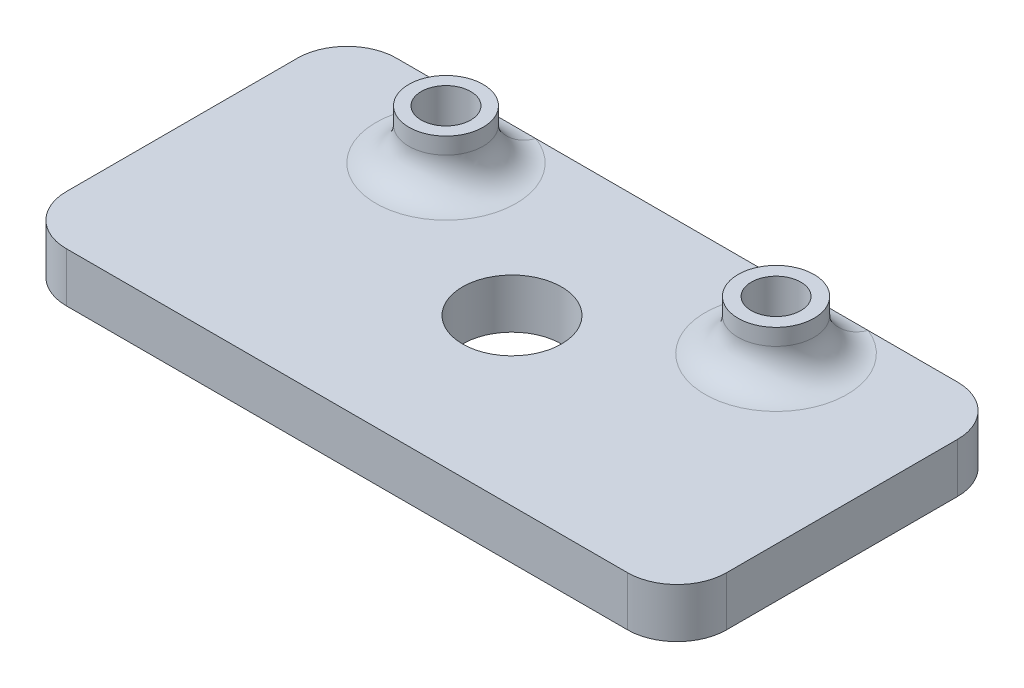
ISO-10303-21;
HEADER;
FILE_DESCRIPTION(('STEP AP214'),'2;1');
FILE_NAME('part.step','',(''),(''),'','','');
FILE_SCHEMA(('AUTOMOTIVE_DESIGN { 1 0 10303 214 1 1 1 1 }'));
ENDSEC;
DATA;
#1=APPLICATION_CONTEXT('core data for automotive mechanical design processes');
#2=APPLICATION_PROTOCOL_DEFINITION('international standard','automotive_design',2000,#1);
#3=PRODUCT_CONTEXT('',#1,'mechanical');
#4=PRODUCT('Part','Part','',(#3));
#5=PRODUCT_RELATED_PRODUCT_CATEGORY('part','',(#4));
#6=PRODUCT_DEFINITION_FORMATION('','',#4);
#7=PRODUCT_DEFINITION_CONTEXT('part definition',#1,'design');
#8=PRODUCT_DEFINITION('design','',#6,#7);
#9=PRODUCT_DEFINITION_SHAPE('','',#8);
#10=(LENGTH_UNIT() NAMED_UNIT(*) SI_UNIT(.MILLI.,.METRE.));
#11=(NAMED_UNIT(*) PLANE_ANGLE_UNIT() SI_UNIT($,.RADIAN.));
#12=(NAMED_UNIT(*) SI_UNIT($,.STERADIAN.) SOLID_ANGLE_UNIT());
#13=UNCERTAINTY_MEASURE_WITH_UNIT(LENGTH_MEASURE(1.E-05),#10,'distance_accuracy_value','');
#14=(GEOMETRIC_REPRESENTATION_CONTEXT(3) GLOBAL_UNCERTAINTY_ASSIGNED_CONTEXT((#13)) GLOBAL_UNIT_ASSIGNED_CONTEXT((#10,
#11,#12)) REPRESENTATION_CONTEXT('',''));
#15=CARTESIAN_POINT('',(0.,0.,0.));
#16=DIRECTION('',(0.,0.,1.));
#17=DIRECTION('',(1.,0.,0.));
#18=AXIS2_PLACEMENT_3D('',#15,#16,#17);
#19=CARTESIAN_POINT('',(0.,3.,0.));
#20=DIRECTION('',(0.,1.,0.));
#21=DIRECTION('',(0.,0.,1.));
#22=AXIS2_PLACEMENT_3D('',#19,#20,#21);
#23=PLANE('',#22);
#24=CARTESIAN_POINT('',(0.,3.,0.));
#25=DIRECTION('',(0.,1.,0.));
#26=DIRECTION('',(0.,0.,1.));
#27=AXIS2_PLACEMENT_3D('',#24,#25,#26);
#28=CIRCLE('',#27,3.);
#29=CARTESIAN_POINT('',(0.,3.,3.));
#30=VERTEX_POINT('',#29);
#31=EDGE_CURVE('E206',#30,#30,#28,.T.);
#32=ORIENTED_EDGE('',*,*,#31,.F.);
#33=EDGE_LOOP('',(#32));
#34=FACE_BOUND('',#33,.T.);
#35=DIRECTION('',(-1.,0.,0.));
#36=VECTOR('',#35,1.);
#37=CARTESIAN_POINT('',(-20.,3.,-10.));
#38=LINE('',#37,#36);
#39=CARTESIAN_POINT('',(17.,3.,-10.));
#40=VERTEX_POINT('',#39);
#41=CARTESIAN_POINT('',(11.5779733838059,3.,-10.));
#42=VERTEX_POINT('',#41);
#43=EDGE_CURVE('E312',#40,#42,#38,.T.);
#44=ORIENTED_EDGE('',*,*,#43,.T.);
#45=CARTESIAN_POINT('',(10.,3.,-6.));
#46=DIRECTION('',(0.,1.,0.));
#47=DIRECTION('',(0.,0.,1.));
#48=AXIS2_PLACEMENT_3D('',#45,#46,#47);
#49=CIRCLE('',#48,4.3);
#50=CARTESIAN_POINT('',(8.42202661619406,3.,-10.));
#51=VERTEX_POINT('',#50);
#52=EDGE_CURVE('E343',#42,#51,#49,.F.);
#53=ORIENTED_EDGE('',*,*,#52,.T.);
#54=CARTESIAN_POINT('',(-8.56385933836549,3.,-10.));
#55=VERTEX_POINT('',#54);
#56=EDGE_CURVE('E337',#51,#55,#38,.T.);
#57=ORIENTED_EDGE('',*,*,#56,.T.);
#58=CARTESIAN_POINT('',(-10.,3.,-6.));
#59=DIRECTION('',(0.,1.,0.));
#60=DIRECTION('',(0.,0.,1.));
#61=AXIS2_PLACEMENT_3D('',#58,#59,#60);
#62=CIRCLE('',#61,4.25);
#63=CARTESIAN_POINT('',(-11.4361406616345,3.,-10.));
#64=VERTEX_POINT('',#63);
#65=EDGE_CURVE('E217',#55,#64,#62,.F.);
#66=ORIENTED_EDGE('',*,*,#65,.T.);
#67=CARTESIAN_POINT('',(-17.,3.,-10.));
#68=VERTEX_POINT('',#67);
#69=EDGE_CURVE('E311',#64,#68,#38,.T.);
#70=ORIENTED_EDGE('',*,*,#69,.T.);
#71=CARTESIAN_POINT('',(-17.,3.,-7.));
#72=DIRECTION('',(0.,1.,0.));
#73=DIRECTION('',(0.,0.,1.));
#74=AXIS2_PLACEMENT_3D('',#71,#72,#73);
#75=CIRCLE('',#74,3.);
#76=CARTESIAN_POINT('',(-20.,3.,-7.));
#77=VERTEX_POINT('',#76);
#78=EDGE_CURVE('E189',#68,#77,#75,.T.);
#79=ORIENTED_EDGE('',*,*,#78,.T.);
#80=DIRECTION('',(0.,0.,1.));
#81=VECTOR('',#80,1.);
#82=CARTESIAN_POINT('',(-20.,3.,-10.));
#83=LINE('',#82,#81);
#84=CARTESIAN_POINT('',(-20.,3.,7.));
#85=VERTEX_POINT('',#84);
#86=EDGE_CURVE('E157',#77,#85,#83,.T.);
#87=ORIENTED_EDGE('',*,*,#86,.T.);
#88=CARTESIAN_POINT('',(-17.,3.,7.));
#89=DIRECTION('',(0.,1.,0.));
#90=DIRECTION('',(0.,0.,1.));
#91=AXIS2_PLACEMENT_3D('',#88,#89,#90);
#92=CIRCLE('',#91,3.);
#93=CARTESIAN_POINT('',(-17.,3.,10.));
#94=VERTEX_POINT('',#93);
#95=EDGE_CURVE('E183',#85,#94,#92,.T.);
#96=ORIENTED_EDGE('',*,*,#95,.T.);
#97=DIRECTION('',(1.,0.,0.));
#98=VECTOR('',#97,1.);
#99=CARTESIAN_POINT('',(-20.,3.,10.));
#100=LINE('',#99,#98);
#101=CARTESIAN_POINT('',(17.,3.,10.));
#102=VERTEX_POINT('',#101);
#103=EDGE_CURVE('E174',#94,#102,#100,.T.);
#104=ORIENTED_EDGE('',*,*,#103,.T.);
#105=CARTESIAN_POINT('',(17.,3.,7.));
#106=DIRECTION('',(0.,1.,0.));
#107=DIRECTION('',(0.,0.,1.));
#108=AXIS2_PLACEMENT_3D('',#105,#106,#107);
#109=CIRCLE('',#108,3.);
#110=CARTESIAN_POINT('',(20.,3.,7.));
#111=VERTEX_POINT('',#110);
#112=EDGE_CURVE('E185',#102,#111,#109,.T.);
#113=ORIENTED_EDGE('',*,*,#112,.T.);
#114=DIRECTION('',(0.,0.,-1.));
#115=VECTOR('',#114,1.);
#116=CARTESIAN_POINT('',(20.,3.,-10.));
#117=LINE('',#116,#115);
#118=CARTESIAN_POINT('',(20.,3.,-7.));
#119=VERTEX_POINT('',#118);
#120=EDGE_CURVE('E168',#111,#119,#117,.T.);
#121=ORIENTED_EDGE('',*,*,#120,.T.);
#122=CARTESIAN_POINT('',(17.,3.,-7.));
#123=DIRECTION('',(0.,1.,0.));
#124=DIRECTION('',(0.,0.,1.));
#125=AXIS2_PLACEMENT_3D('',#122,#123,#124);
#126=CIRCLE('',#125,3.);
#127=EDGE_CURVE('E187',#119,#40,#126,.T.);
#128=ORIENTED_EDGE('',*,*,#127,.T.);
#129=EDGE_LOOP('',(#44,#53,#57,#66,#70,#79,#87,#96,#104,#113,#121,#128));
#130=FACE_BOUND('',#129,.T.);
#131=ADVANCED_FACE('F40',(#34,#130),#23,.T.);
#132=CARTESIAN_POINT('',(0.,0.,0.));
#133=DIRECTION('',(0.,1.,0.));
#134=DIRECTION('',(0.,0.,1.));
#135=AXIS2_PLACEMENT_3D('',#132,#133,#134);
#136=PLANE('',#135);
#137=CARTESIAN_POINT('',(0.,0.,0.));
#138=DIRECTION('',(0.,1.,0.));
#139=DIRECTION('',(0.,0.,1.));
#140=AXIS2_PLACEMENT_3D('',#137,#138,#139);
#141=CIRCLE('',#140,3.);
#142=CARTESIAN_POINT('',(0.,0.,3.));
#143=VERTEX_POINT('',#142);
#144=EDGE_CURVE('E202',#143,#143,#141,.T.);
#145=ORIENTED_EDGE('',*,*,#144,.T.);
#146=EDGE_LOOP('',(#145));
#147=FACE_BOUND('',#146,.T.);
#148=DIRECTION('',(0.,0.,1.));
#149=VECTOR('',#148,1.);
#150=CARTESIAN_POINT('',(-20.,0.,-10.));
#151=LINE('',#150,#149);
#152=CARTESIAN_POINT('',(-20.,0.,-7.));
#153=VERTEX_POINT('',#152);
#154=CARTESIAN_POINT('',(-20.,0.,7.));
#155=VERTEX_POINT('',#154);
#156=EDGE_CURVE('E154',#153,#155,#151,.T.);
#157=ORIENTED_EDGE('',*,*,#156,.F.);
#158=CARTESIAN_POINT('',(-17.,0.,-7.));
#159=DIRECTION('',(0.,1.,0.));
#160=DIRECTION('',(0.,0.,1.));
#161=AXIS2_PLACEMENT_3D('',#158,#159,#160);
#162=CIRCLE('',#161,3.);
#163=CARTESIAN_POINT('',(-17.,0.,-10.));
#164=VERTEX_POINT('',#163);
#165=EDGE_CURVE('E136',#153,#164,#162,.F.);
#166=ORIENTED_EDGE('',*,*,#165,.T.);
#167=DIRECTION('',(-1.,0.,0.));
#168=VECTOR('',#167,1.);
#169=CARTESIAN_POINT('',(-20.,0.,-10.));
#170=LINE('',#169,#168);
#171=CARTESIAN_POINT('',(17.,0.,-10.));
#172=VERTEX_POINT('',#171);
#173=EDGE_CURVE('E165',#172,#164,#170,.T.);
#174=ORIENTED_EDGE('',*,*,#173,.F.);
#175=CARTESIAN_POINT('',(17.,0.,-7.));
#176=DIRECTION('',(0.,1.,0.));
#177=DIRECTION('',(0.,0.,1.));
#178=AXIS2_PLACEMENT_3D('',#175,#176,#177);
#179=CIRCLE('',#178,3.);
#180=CARTESIAN_POINT('',(20.,0.,-7.));
#181=VERTEX_POINT('',#180);
#182=EDGE_CURVE('E148',#172,#181,#179,.F.);
#183=ORIENTED_EDGE('',*,*,#182,.T.);
#184=DIRECTION('',(0.,0.,-1.));
#185=VECTOR('',#184,1.);
#186=CARTESIAN_POINT('',(20.,0.,-10.));
#187=LINE('',#186,#185);
#188=CARTESIAN_POINT('',(20.,0.,7.));
#189=VERTEX_POINT('',#188);
#190=EDGE_CURVE('E170',#189,#181,#187,.T.);
#191=ORIENTED_EDGE('',*,*,#190,.F.);
#192=CARTESIAN_POINT('',(17.,0.,7.));
#193=DIRECTION('',(0.,1.,0.));
#194=DIRECTION('',(0.,0.,1.));
#195=AXIS2_PLACEMENT_3D('',#192,#193,#194);
#196=CIRCLE('',#195,3.);
#197=CARTESIAN_POINT('',(17.,0.,10.));
#198=VERTEX_POINT('',#197);
#199=EDGE_CURVE('E177',#189,#198,#196,.F.);
#200=ORIENTED_EDGE('',*,*,#199,.T.);
#201=DIRECTION('',(1.,0.,0.));
#202=VECTOR('',#201,1.);
#203=CARTESIAN_POINT('',(-20.,0.,10.));
#204=LINE('',#203,#202);
#205=CARTESIAN_POINT('',(-17.,0.,10.));
#206=VERTEX_POINT('',#205);
#207=EDGE_CURVE('E164',#206,#198,#204,.T.);
#208=ORIENTED_EDGE('',*,*,#207,.F.);
#209=CARTESIAN_POINT('',(-17.,0.,7.));
#210=DIRECTION('',(0.,1.,0.));
#211=DIRECTION('',(0.,0.,1.));
#212=AXIS2_PLACEMENT_3D('',#209,#210,#211);
#213=CIRCLE('',#212,3.);
#214=EDGE_CURVE('E158',#206,#155,#213,.F.);
#215=ORIENTED_EDGE('',*,*,#214,.T.);
#216=EDGE_LOOP('',(#157,#166,#174,#183,#191,#200,#208,#215));
#217=FACE_BOUND('',#216,.T.);
#218=CARTESIAN_POINT('',(-10.,0.,-6.));
#219=DIRECTION('',(0.,1.,0.));
#220=DIRECTION('',(0.,0.,1.));
#221=AXIS2_PLACEMENT_3D('',#218,#219,#220);
#222=CIRCLE('',#221,1.5);
#223=CARTESIAN_POINT('',(-10.,0.,-4.5));
#224=VERTEX_POINT('',#223);
#225=EDGE_CURVE('E306',#224,#224,#222,.T.);
#226=ORIENTED_EDGE('',*,*,#225,.T.);
#227=EDGE_LOOP('',(#226));
#228=FACE_BOUND('',#227,.T.);
#229=CARTESIAN_POINT('',(10.,0.,-6.));
#230=DIRECTION('',(0.,1.,0.));
#231=DIRECTION('',(0.,0.,-1.));
#232=AXIS2_PLACEMENT_3D('',#229,#230,#231);
#233=CIRCLE('',#232,1.5);
#234=CARTESIAN_POINT('',(10.,0.,-7.5));
#235=VERTEX_POINT('',#234);
#236=EDGE_CURVE('E303',#235,#235,#233,.T.);
#237=ORIENTED_EDGE('',*,*,#236,.T.);
#238=EDGE_LOOP('',(#237));
#239=FACE_BOUND('',#238,.T.);
#240=ADVANCED_FACE('F161',(#147,#217,#228,#239),#136,.F.);
#241=CARTESIAN_POINT('',(20.,3.,-10.));
#242=DIRECTION('',(-1.,0.,0.));
#243=DIRECTION('',(0.,0.,1.));
#244=AXIS2_PLACEMENT_3D('',#241,#242,#243);
#245=PLANE('',#244);
#246=ORIENTED_EDGE('',*,*,#190,.T.);
#247=DIRECTION('',(0.,-1.,0.));
#248=VECTOR('',#247,1.);
#249=CARTESIAN_POINT('',(20.,3.,-7.));
#250=LINE('',#249,#248);
#251=EDGE_CURVE('E194',#181,#119,#250,.F.);
#252=ORIENTED_EDGE('',*,*,#251,.T.);
#253=ORIENTED_EDGE('',*,*,#120,.F.);
#254=DIRECTION('',(0.,-1.,0.));
#255=VECTOR('',#254,1.);
#256=CARTESIAN_POINT('',(20.,3.,7.));
#257=LINE('',#256,#255);
#258=EDGE_CURVE('E191',#111,#189,#257,.T.);
#259=ORIENTED_EDGE('',*,*,#258,.T.);
#260=EDGE_LOOP('',(#246,#252,#253,#259));
#261=FACE_BOUND('',#260,.T.);
#262=ADVANCED_FACE('F322',(#261),#245,.F.);
#263=CARTESIAN_POINT('',(-20.,3.,-10.));
#264=DIRECTION('',(0.,0.,1.));
#265=DIRECTION('',(1.,0.,0.));
#266=AXIS2_PLACEMENT_3D('',#263,#264,#265);
#267=PLANE('',#266);
#268=ORIENTED_EDGE('',*,*,#173,.T.);
#269=DIRECTION('',(0.,-1.,0.));
#270=VECTOR('',#269,1.);
#271=CARTESIAN_POINT('',(-17.,3.,-10.));
#272=LINE('',#271,#270);
#273=EDGE_CURVE('E142',#164,#68,#272,.F.);
#274=ORIENTED_EDGE('',*,*,#273,.T.);
#275=ORIENTED_EDGE('',*,*,#69,.F.);
#276=EDGE_CURVE('E339',#55,#64,#38,.T.);
#277=ORIENTED_EDGE('',*,*,#276,.F.);
#278=ORIENTED_EDGE('',*,*,#56,.F.);
#279=EDGE_CURVE('E315',#42,#51,#38,.T.);
#280=ORIENTED_EDGE('',*,*,#279,.F.);
#281=ORIENTED_EDGE('',*,*,#43,.F.);
#282=DIRECTION('',(0.,-1.,0.));
#283=VECTOR('',#282,1.);
#284=CARTESIAN_POINT('',(17.,3.,-10.));
#285=LINE('',#284,#283);
#286=EDGE_CURVE('E147',#40,#172,#285,.T.);
#287=ORIENTED_EDGE('',*,*,#286,.T.);
#288=EDGE_LOOP('',(#268,#274,#275,#277,#278,#280,#281,#287));
#289=FACE_BOUND('',#288,.T.);
#290=ADVANCED_FACE('F333',(#289),#267,.F.);
#291=CARTESIAN_POINT('',(-20.,3.,-10.));
#292=DIRECTION('',(1.,0.,0.));
#293=DIRECTION('',(0.,0.,-1.));
#294=AXIS2_PLACEMENT_3D('',#291,#292,#293);
#295=PLANE('',#294);
#296=ORIENTED_EDGE('',*,*,#86,.F.);
#297=DIRECTION('',(0.,-1.,0.));
#298=VECTOR('',#297,1.);
#299=CARTESIAN_POINT('',(-20.,3.,-7.));
#300=LINE('',#299,#298);
#301=EDGE_CURVE('E140',#77,#153,#300,.T.);
#302=ORIENTED_EDGE('',*,*,#301,.T.);
#303=ORIENTED_EDGE('',*,*,#156,.T.);
#304=DIRECTION('',(0.,-1.,0.));
#305=VECTOR('',#304,1.);
#306=CARTESIAN_POINT('',(-20.,3.,7.));
#307=LINE('',#306,#305);
#308=EDGE_CURVE('E159',#155,#85,#307,.F.);
#309=ORIENTED_EDGE('',*,*,#308,.T.);
#310=EDGE_LOOP('',(#296,#302,#303,#309));
#311=FACE_BOUND('',#310,.T.);
#312=ADVANCED_FACE('F153',(#311),#295,.F.);
#313=CARTESIAN_POINT('',(-20.,3.,10.));
#314=DIRECTION('',(0.,0.,-1.));
#315=DIRECTION('',(-1.,0.,0.));
#316=AXIS2_PLACEMENT_3D('',#313,#314,#315);
#317=PLANE('',#316);
#318=ORIENTED_EDGE('',*,*,#207,.T.);
#319=DIRECTION('',(0.,-1.,0.));
#320=VECTOR('',#319,1.);
#321=CARTESIAN_POINT('',(17.,3.,10.));
#322=LINE('',#321,#320);
#323=EDGE_CURVE('E199',#198,#102,#322,.F.);
#324=ORIENTED_EDGE('',*,*,#323,.T.);
#325=ORIENTED_EDGE('',*,*,#103,.F.);
#326=DIRECTION('',(0.,-1.,0.));
#327=VECTOR('',#326,1.);
#328=CARTESIAN_POINT('',(-17.,3.,10.));
#329=LINE('',#328,#327);
#330=EDGE_CURVE('E196',#94,#206,#329,.T.);
#331=ORIENTED_EDGE('',*,*,#330,.T.);
#332=EDGE_LOOP('',(#318,#324,#325,#331));
#333=FACE_BOUND('',#332,.T.);
#334=ADVANCED_FACE('F362',(#333),#317,.F.);
#335=CARTESIAN_POINT('',(-10.,3.,-6.));
#336=DIRECTION('',(0.,-1.,0.));
#337=DIRECTION('',(0.,0.,-1.));
#338=AXIS2_PLACEMENT_3D('',#335,#336,#337);
#339=CYLINDRICAL_SURFACE('',#338,1.5);
#340=ORIENTED_EDGE('',*,*,#225,.F.);
#341=EDGE_LOOP('',(#340));
#342=FACE_BOUND('',#341,.T.);
#343=CARTESIAN_POINT('',(-10.,6.,-6.));
#344=DIRECTION('',(0.,1.,0.));
#345=DIRECTION('',(0.,0.,1.));
#346=AXIS2_PLACEMENT_3D('',#343,#344,#345);
#347=CIRCLE('',#346,1.5);
#348=CARTESIAN_POINT('',(-10.,6.,-4.5));
#349=VERTEX_POINT('',#348);
#350=EDGE_CURVE('E297',#349,#349,#347,.T.);
#351=ORIENTED_EDGE('',*,*,#350,.T.);
#352=EDGE_LOOP('',(#351));
#353=FACE_BOUND('',#352,.T.);
#354=ADVANCED_FACE('F355',(#342,#353),#339,.F.);
#355=CARTESIAN_POINT('',(10.,3.,-6.));
#356=DIRECTION('',(0.,-1.,0.));
#357=DIRECTION('',(0.,0.,-1.));
#358=AXIS2_PLACEMENT_3D('',#355,#356,#357);
#359=CYLINDRICAL_SURFACE('',#358,1.5);
#360=ORIENTED_EDGE('',*,*,#236,.F.);
#361=EDGE_LOOP('',(#360));
#362=FACE_BOUND('',#361,.T.);
#363=CARTESIAN_POINT('',(10.,6.,-6.));
#364=DIRECTION('',(0.,1.,0.));
#365=DIRECTION('',(0.,0.,1.));
#366=AXIS2_PLACEMENT_3D('',#363,#364,#365);
#367=CIRCLE('',#366,1.5);
#368=CARTESIAN_POINT('',(10.,6.,-4.5));
#369=VERTEX_POINT('',#368);
#370=EDGE_CURVE('E205',#369,#369,#367,.T.);
#371=ORIENTED_EDGE('',*,*,#370,.T.);
#372=EDGE_LOOP('',(#371));
#373=FACE_BOUND('',#372,.T.);
#374=ADVANCED_FACE('F271',(#362,#373),#359,.F.);
#375=CARTESIAN_POINT('',(-17.,3.,-7.));
#376=DIRECTION('',(0.,-1.,0.));
#377=DIRECTION('',(0.,0.,-1.));
#378=AXIS2_PLACEMENT_3D('',#375,#376,#377);
#379=CYLINDRICAL_SURFACE('',#378,3.);
#380=ORIENTED_EDGE('',*,*,#78,.F.);
#381=ORIENTED_EDGE('',*,*,#273,.F.);
#382=ORIENTED_EDGE('',*,*,#165,.F.);
#383=ORIENTED_EDGE('',*,*,#301,.F.);
#384=EDGE_LOOP('',(#380,#381,#382,#383));
#385=FACE_BOUND('',#384,.T.);
#386=ADVANCED_FACE('F139',(#385),#379,.T.);
#387=CARTESIAN_POINT('',(17.,3.,-7.));
#388=DIRECTION('',(0.,-1.,0.));
#389=DIRECTION('',(0.,0.,-1.));
#390=AXIS2_PLACEMENT_3D('',#387,#388,#389);
#391=CYLINDRICAL_SURFACE('',#390,3.);
#392=ORIENTED_EDGE('',*,*,#127,.F.);
#393=ORIENTED_EDGE('',*,*,#251,.F.);
#394=ORIENTED_EDGE('',*,*,#182,.F.);
#395=ORIENTED_EDGE('',*,*,#286,.F.);
#396=EDGE_LOOP('',(#392,#393,#394,#395));
#397=FACE_BOUND('',#396,.T.);
#398=ADVANCED_FACE('F327',(#397),#391,.T.);
#399=CARTESIAN_POINT('',(17.,3.,7.));
#400=DIRECTION('',(0.,-1.,0.));
#401=DIRECTION('',(0.,0.,-1.));
#402=AXIS2_PLACEMENT_3D('',#399,#400,#401);
#403=CYLINDRICAL_SURFACE('',#402,3.);
#404=ORIENTED_EDGE('',*,*,#112,.F.);
#405=ORIENTED_EDGE('',*,*,#323,.F.);
#406=ORIENTED_EDGE('',*,*,#199,.F.);
#407=ORIENTED_EDGE('',*,*,#258,.F.);
#408=EDGE_LOOP('',(#404,#405,#406,#407));
#409=FACE_BOUND('',#408,.T.);
#410=ADVANCED_FACE('F386',(#409),#403,.T.);
#411=CARTESIAN_POINT('',(-17.,3.,7.));
#412=DIRECTION('',(0.,-1.,0.));
#413=DIRECTION('',(0.,0.,-1.));
#414=AXIS2_PLACEMENT_3D('',#411,#412,#413);
#415=CYLINDRICAL_SURFACE('',#414,3.);
#416=ORIENTED_EDGE('',*,*,#95,.F.);
#417=ORIENTED_EDGE('',*,*,#308,.F.);
#418=ORIENTED_EDGE('',*,*,#214,.F.);
#419=ORIENTED_EDGE('',*,*,#330,.F.);
#420=EDGE_LOOP('',(#416,#417,#418,#419));
#421=FACE_BOUND('',#420,.T.);
#422=ADVANCED_FACE('F227',(#421),#415,.T.);
#423=CARTESIAN_POINT('',(-10.,6.,-6.));
#424=DIRECTION('',(0.,1.,0.));
#425=DIRECTION('',(0.,0.,1.));
#426=AXIS2_PLACEMENT_3D('',#423,#424,#425);
#427=PLANE('',#426);
#428=CARTESIAN_POINT('',(-10.,6.,-6.));
#429=DIRECTION('',(0.,1.,0.));
#430=DIRECTION('',(0.,0.,1.));
#431=AXIS2_PLACEMENT_3D('',#428,#429,#430);
#432=CIRCLE('',#431,2.25);
#433=CARTESIAN_POINT('',(-10.,6.,-3.75));
#434=VERTEX_POINT('',#433);
#435=EDGE_CURVE('E300',#434,#434,#432,.T.);
#436=ORIENTED_EDGE('',*,*,#435,.T.);
#437=EDGE_LOOP('',(#436));
#438=FACE_BOUND('',#437,.T.);
#439=ORIENTED_EDGE('',*,*,#350,.F.);
#440=EDGE_LOOP('',(#439));
#441=FACE_BOUND('',#440,.T.);
#442=ADVANCED_FACE('F270',(#438,#441),#427,.T.);
#443=CARTESIAN_POINT('',(-10.,6.,-6.));
#444=DIRECTION('',(0.,-1.,0.));
#445=DIRECTION('',(0.,0.,-1.));
#446=AXIS2_PLACEMENT_3D('',#443,#444,#445);
#447=CYLINDRICAL_SURFACE('',#446,2.25);
#448=CARTESIAN_POINT('',(-10.,5.,-6.));
#449=DIRECTION('',(0.,1.,0.));
#450=DIRECTION('',(0.,0.,1.));
#451=AXIS2_PLACEMENT_3D('',#448,#449,#450);
#452=CIRCLE('',#451,2.25);
#453=CARTESIAN_POINT('',(-10.7603097620418,5.,-8.11764705882353));
#454=VERTEX_POINT('',#453);
#455=CARTESIAN_POINT('',(-9.2396902379582,5.,-8.11764705882353));
#456=VERTEX_POINT('',#455);
#457=EDGE_CURVE('E54',#454,#456,#452,.T.);
#458=ORIENTED_EDGE('',*,*,#457,.T.);
#459=CARTESIAN_POINT('',(-8.85911905174189,4.97142471019287,-7.93930159126983));
#460=CARTESIAN_POINT('',(-9.03135092752445,2.66518421719734,-8.04062469988153));
#461=CARTESIAN_POINT('',(-7.84500265329025,3.,-10.));
#462=CARTESIAN_POINT('',(-8.90931919342929,4.98091035254833,-7.96884632930647));
#463=CARTESIAN_POINT('',(-9.0433288239547,2.7219689606109,-8.04194946488532));
#464=CARTESIAN_POINT('',(-7.93982514313482,3.,-10.));
#465=CARTESIAN_POINT('',(-8.96075873146319,4.9874402564998,-7.99647196134159));
#466=CARTESIAN_POINT('',(-9.06346491750315,2.77520566808486,-8.04915521665268));
#467=CARTESIAN_POINT('',(-8.03698871497578,3.,-10.));
#468=CARTESIAN_POINT('',(-9.06567001221284,4.99622896182381,-8.04766163206406));
#469=CARTESIAN_POINT('',(-9.1172406136545,2.87199466073114,-8.07032391847802));
#470=CARTESIAN_POINT('',(-8.23515446750674,3.,-10.));
#471=CARTESIAN_POINT('',(-9.11913996336388,4.99849144321305,-8.07122915431263));
#472=CARTESIAN_POINT('',(-9.15063632638604,2.91588496944659,-8.08415790727249));
#473=CARTESIAN_POINT('',(-8.33615326413007,3.,-10.));
#474=CARTESIAN_POINT('',(-9.22766941405586,5.00039489700643,-8.11409768583682));
#475=CARTESIAN_POINT('',(-9.22840622077427,2.99364798323543,-8.11391010872684));
#476=CARTESIAN_POINT('',(-8.54115333766278,3.,-10.));
#477=CARTESIAN_POINT('',(-9.28272632462135,5.00003992241902,-8.13340524373548));
#478=CARTESIAN_POINT('',(-9.27267584774073,3.02783966235876,-8.12983100229219));
#479=CARTESIAN_POINT('',(-8.64514972428519,3.,-10.));
#480=CARTESIAN_POINT('',(-9.39417769548852,4.99802860224111,-8.16768962010063));
#481=CARTESIAN_POINT('',(-9.36956773129189,3.08702326598563,-8.16059436560118));
#482=CARTESIAN_POINT('',(-8.85566898036671,3.,-10.));
#483=CARTESIAN_POINT('',(-9.4505724509871,4.99637196679826,-8.1826654729717));
#484=CARTESIAN_POINT('',(-9.42223349780092,3.11225378804796,-8.17550595244705));
#485=CARTESIAN_POINT('',(-8.96219240741995,3.,-10.));
#486=CARTESIAN_POINT('',(-9.56566077827899,4.99277975067754,-8.20848525850407));
#487=CARTESIAN_POINT('',(-9.53475843061734,3.15480036834461,-8.20236324288039));
#488=CARTESIAN_POINT('',(-9.17958147008267,3.,-10.));
#489=CARTESIAN_POINT('',(-9.62437739490697,4.99083863398425,-8.21922631476964));
#490=CARTESIAN_POINT('',(-9.59491867955596,3.17210938057854,-8.21432757597736));
#491=CARTESIAN_POINT('',(-9.2904906348243,3.,-10.));
#492=CARTESIAN_POINT('',(-9.74250632508195,4.98752767310327,-8.23601372101379));
#493=CARTESIAN_POINT('',(-9.71902772823501,3.19874257189235,-8.23338444766382));
#494=CARTESIAN_POINT('',(-9.51362305848808,3.,-10.));
#495=CARTESIAN_POINT('',(-9.80191890306805,4.98615805381272,-8.24205822359753));
#496=CARTESIAN_POINT('',(-9.7832038008434,3.20817739338052,-8.24055023576381));
#497=CARTESIAN_POINT('',(-9.6258468169063,3.,-10.));
#498=CARTESIAN_POINT('',(-9.92105609320247,4.98446682157146,-8.24940669861293));
#499=CARTESIAN_POINT('',(-9.91303062107756,3.21956924583799,-8.24926422473867));
#500=CARTESIAN_POINT('',(-9.85088373160468,3.,-10.));
#501=CARTESIAN_POINT('',(-9.98078077825151,4.98414546553343,-8.25070950894023));
#502=CARTESIAN_POINT('',(-9.9789496596533,3.22157275932892,-8.25084767272541));
#503=CARTESIAN_POINT('',(-9.96369702558619,3.,-10.));
#504=CARTESIAN_POINT('',(-10.1001196195545,4.98465433313186,-8.24856322406253));
#505=CARTESIAN_POINT('',(-10.1099827302008,3.21826292599368,-8.24828053802073));
#506=CARTESIAN_POINT('',(-10.1891148369362,3.,-10.));
#507=CARTESIAN_POINT('',(-10.159733809157,4.98548411971008,-8.24511593234834));
#508=CARTESIAN_POINT('',(-10.1753737447182,3.21293836264595,-8.24412122175896));
#509=CARTESIAN_POINT('',(-10.3017194172966,3.,-10.));
#510=CARTESIAN_POINT('',(-10.2817588502896,4.9880941357226,-8.23317558540337));
#511=CARTESIAN_POINT('',(-10.3066895263139,3.19426884447937,-8.23016804015149));
#512=CARTESIAN_POINT('',(-10.5322111616582,3.,-10.));
#513=CARTESIAN_POINT('',(-10.3441434388462,4.98992407142236,-8.22441575618934));
#514=CARTESIAN_POINT('',(-10.3727156369234,3.18041330174289,-8.22001503888396));
#515=CARTESIAN_POINT('',(-10.6500487178209,3.,-10.));
#516=CARTESIAN_POINT('',(-10.4679567688152,4.99380326989383,-8.20169916016527));
#517=CARTESIAN_POINT('',(-10.4987923026239,3.14373455397596,-8.19519124263461));
#518=CARTESIAN_POINT('',(-10.8839183410956,3.,-10.));
#519=CARTESIAN_POINT('',(-10.529385486728,4.995852538048,-8.18774226579746));
#520=CARTESIAN_POINT('',(-10.5590676878125,3.12073620905516,-8.18041781603538));
#521=CARTESIAN_POINT('',(-10.9999503638195,3.,-10.));
#522=CARTESIAN_POINT('',(-10.6509868827656,4.99902485064436,-8.15469035568411));
#523=CARTESIAN_POINT('',(-10.6709682708332,3.06481003048167,-8.14850406563376));
#524=CARTESIAN_POINT('',(-11.2296418896684,3.,-10.));
#525=CARTESIAN_POINT('',(-10.7111568414694,5.00014605834227,-8.13558524953258));
#526=CARTESIAN_POINT('',(-10.7226845633494,3.03159450884279,-8.13125563154112));
#527=CARTESIAN_POINT('',(-11.3432962561088,3.,-10.));
#528=CARTESIAN_POINT('',(-10.8296902349015,4.99983006318719,-8.09239184260857));
#529=CARTESIAN_POINT('',(-10.8145832046748,2.95463950355987,-8.09802845590853));
#530=CARTESIAN_POINT('',(-11.5671926659251,3.,-10.));
#531=CARTESIAN_POINT('',(-10.888053270938,4.99839229974086,-8.06830245095131));
#532=CARTESIAN_POINT('',(-10.8547142675478,2.91054320135223,-8.08201080430531));
#533=CARTESIAN_POINT('',(-11.6774339562163,3.,-10.));
#534=CARTESIAN_POINT('',(-10.9452869597812,4.99486157840885,-8.04179640602771));
#535=CARTESIAN_POINT('',(-10.88686598144,2.86130192071052,-8.06884346558787));
#536=CARTESIAN_POINT('',(-11.7855420351422,3.,-10.));
#537=(BOUNDED_SURFACE() B_SPLINE_SURFACE(3,2,((#459,#460,#461),(#462,#463,#464),(#465,#466,
#467),(#468,#469,#470),(#471,#472,#473),(#474,#475,#476),(#477,#478,#479),(#480,#481,#482),
(#483,#484,#485),(#486,#487,#488),(#489,#490,#491),(#492,#493,#494),(#495,#496,#497),(#498,#499,
#500),(#501,#502,#503),(#504,#505,#506),(#507,#508,#509),(#510,#511,#512),(#513,#514,#515),
(#516,#517,#518),(#519,#520,#521),(#522,#523,#524),(#525,#526,#527),(#528,#529,#530),(#531,#532,
#533),(#534,#535,#536)),.UNSPECIFIED.,.F.,.F.,.F.) B_SPLINE_SURFACE_WITH_KNOTS((4,2,2,2,2,2,2,2,
2,2,2,2,4),(3,3),(0.,0.33107339408904,0.661861155897259,0.992136815977627,1.32248604231452,
1.66042781884525,1.99850245796545,2.33665994758483,2.67468908292792,3.03128700779519,
3.38789368564827,3.74520445521131,4.10259351041279),(0.,1.),
.UNSPECIFIED.) GEOMETRIC_REPRESENTATION_ITEM() RATIONAL_B_SPLINE_SURFACE(((1.,0.653766711578438,
1.),(1.,0.6621271078572,1.),(1.,0.670186587838737,1.),(1.,0.685449396092848,1.),(1.,
0.692653457008054,1.),(1.,0.705956082489684,1.),(1.,0.712056341239762,1.),(1.,0.723004027721563,
1.),(1.,0.72785117609256,1.),(1.,0.736265410042961,1.),(1.,0.739800514977537,1.),(1.,
0.745346115450583,1.),(1.,0.747356011038932,1.),(1.,0.749801365860641,1.),(1.,0.750236439132939,
1.),(1.,0.749521155937819,1.),(1.,0.748371401188525,1.),(1.,0.74440801902748,1.),(1.,
0.741506460388717,1.),(1.,0.734047887487806,1.),(1.,0.729490832592902,1.),(1.,0.718833482731377,
1.),(1.,0.712730158524107,1.),(1.,0.699185991795137,1.),(1.,0.691744856520463,1.),(1.,
0.683736854346766,1.))) REPRESENTATION_ITEM('') SURFACE());
#538=CARTESIAN_POINT('',(-8.85911905174189,4.97142471019287,-7.93930159126983));
#539=CARTESIAN_POINT('',(-8.90931919342929,4.98091035254833,-7.96884632930647));
#540=CARTESIAN_POINT('',(-8.96075873146319,4.9874402564998,-7.99647196134159));
#541=CARTESIAN_POINT('',(-9.06567001221284,4.99622896182381,-8.04766163206405));
#542=CARTESIAN_POINT('',(-9.11913996336388,4.99849144321305,-8.07122915431263));
#543=CARTESIAN_POINT('',(-9.22766941405586,5.00039489700643,-8.11409768583682));
#544=CARTESIAN_POINT('',(-9.28272632462135,5.00003992241902,-8.13340524373548));
#545=CARTESIAN_POINT('',(-9.39417769548852,4.99802860224111,-8.16768962010064));
#546=CARTESIAN_POINT('',(-9.4505724509871,4.99637196679826,-8.18266547297171));
#547=CARTESIAN_POINT('',(-9.56566077827899,4.99277975067754,-8.20848525850407));
#548=CARTESIAN_POINT('',(-9.62437739490697,4.99083863398425,-8.21922631476964));
#549=CARTESIAN_POINT('',(-9.74250632508195,4.98752767310327,-8.23601372101379));
#550=CARTESIAN_POINT('',(-9.80191890306805,4.98615805381272,-8.24205822359753));
#551=CARTESIAN_POINT('',(-9.92105609320247,4.98446682157146,-8.24940669861293));
#552=CARTESIAN_POINT('',(-9.98078077825151,4.98414546553343,-8.25070950894023));
#553=CARTESIAN_POINT('',(-10.1001196195545,4.98465433313186,-8.24856322406253));
#554=CARTESIAN_POINT('',(-10.159733809157,4.98548411971008,-8.24511593234834));
#555=CARTESIAN_POINT('',(-10.2817588502896,4.9880941357226,-8.23317558540337));
#556=CARTESIAN_POINT('',(-10.3441434388462,4.98992407142236,-8.22441575618934));
#557=CARTESIAN_POINT('',(-10.4679567688152,4.99380326989383,-8.20169916016527));
#558=CARTESIAN_POINT('',(-10.529385486728,4.995852538048,-8.18774226579746));
#559=CARTESIAN_POINT('',(-10.6509868827656,4.99902485064436,-8.15469035568411));
#560=CARTESIAN_POINT('',(-10.7111568414694,5.00014605834227,-8.13558524953258));
#561=CARTESIAN_POINT('',(-10.8296902349015,4.99983006318719,-8.09239184260857));
#562=CARTESIAN_POINT('',(-10.888053270938,4.99839229974086,-8.06830245095131));
#563=CARTESIAN_POINT('',(-10.9452869597812,4.99486157840885,-8.04179640602771));
#564=B_SPLINE_CURVE_WITH_KNOTS('',3,(#538,#539,#540,#541,#542,#543,#544,#545,#546,#547,#548,
#549,#550,#551,#552,#553,#554,#555,#556,#557,#558,#559,#560,#561,#562,#563),.UNSPECIFIED.,.F.,
.F.,(4,2,2,2,2,2,2,2,2,2,2,2,4),(0.,0.33107339408904,0.661861155897259,0.992136815977627,
1.32248604231452,1.66042781884525,1.99850245796545,2.33665994758483,2.67468908292792,
3.03128700779519,3.38789368564827,3.74520445521131,4.10259351041279),.UNSPECIFIED.);
#565=EDGE_CURVE('E11',#456,#454,#564,.T.);
#566=ORIENTED_EDGE('',*,*,#565,.T.);
#567=EDGE_LOOP('',(#458,#566));
#568=FACE_BOUND('',#567,.T.);
#569=ORIENTED_EDGE('',*,*,#435,.F.);
#570=EDGE_LOOP('',(#569));
#571=FACE_BOUND('',#570,.T.);
#572=ADVANCED_FACE('F265',(#568,#571),#447,.T.);
#573=CARTESIAN_POINT('',(10.,6.,-6.));
#574=DIRECTION('',(0.,1.,0.));
#575=DIRECTION('',(0.,0.,1.));
#576=AXIS2_PLACEMENT_3D('',#573,#574,#575);
#577=PLANE('',#576);
#578=CARTESIAN_POINT('',(10.,6.,-6.));
#579=DIRECTION('',(0.,1.,0.));
#580=DIRECTION('',(0.,0.,1.));
#581=AXIS2_PLACEMENT_3D('',#578,#579,#580);
#582=CIRCLE('',#581,2.3);
#583=CARTESIAN_POINT('',(10.,6.,-3.7));
#584=VERTEX_POINT('',#583);
#585=EDGE_CURVE('E294',#584,#584,#582,.T.);
#586=ORIENTED_EDGE('',*,*,#585,.T.);
#587=EDGE_LOOP('',(#586));
#588=FACE_BOUND('',#587,.T.);
#589=ORIENTED_EDGE('',*,*,#370,.F.);
#590=EDGE_LOOP('',(#589));
#591=FACE_BOUND('',#590,.T.);
#592=ADVANCED_FACE('F269',(#588,#591),#577,.T.);
#593=CARTESIAN_POINT('',(10.,6.,-6.));
#594=DIRECTION('',(0.,-1.,0.));
#595=DIRECTION('',(0.,0.,-1.));
#596=AXIS2_PLACEMENT_3D('',#593,#594,#595);
#597=CYLINDRICAL_SURFACE('',#596,2.3);
#598=CARTESIAN_POINT('',(10.,5.,-6.));
#599=DIRECTION('',(0.,1.,0.));
#600=DIRECTION('',(0.,0.,1.));
#601=AXIS2_PLACEMENT_3D('',#598,#599,#600);
#602=CIRCLE('',#601,2.3);
#603=CARTESIAN_POINT('',(9.15596772494101,5.,-8.13953488372093));
#604=VERTEX_POINT('',#603);
#605=CARTESIAN_POINT('',(10.844032275059,5.,-8.13953488372093));
#606=VERTEX_POINT('',#605);
#607=EDGE_CURVE('E201',#604,#606,#602,.T.);
#608=ORIENTED_EDGE('',*,*,#607,.T.);
#609=CARTESIAN_POINT('',(11.1887069894329,4.97442507435685,-7.96900373114765));
#610=CARTESIAN_POINT('',(11.025352172077,2.68797051938578,-8.06762264693577));
#611=CARTESIAN_POINT('',(12.2223652411137,3.,-10.));
#612=CARTESIAN_POINT('',(11.1379811485171,4.98362420413529,-7.99963984549799));
#613=CARTESIAN_POINT('',(11.0129839141273,2.74527465350033,-8.06962392954436));
#614=CARTESIAN_POINT('',(12.1275299733219,3.,-10.));
#615=CARTESIAN_POINT('',(11.0859815214353,4.98978396248726,-8.02834554134298));
#616=CARTESIAN_POINT('',(10.9924118001562,2.79905255510665,-8.07765528141249));
#617=CARTESIAN_POINT('',(12.0303132792132,3.,-10.));
#618=CARTESIAN_POINT('',(10.9798859631142,4.99770925023651,-8.08166559777508));
#619=CARTESIAN_POINT('',(10.9376249616922,2.89692294038788,-8.10068203758062));
#620=CARTESIAN_POINT('',(11.8319607136534,3.,-10.));
#621=CARTESIAN_POINT('',(10.9257919796059,4.99947876734618,-8.10628365223671));
#622=CARTESIAN_POINT('',(10.9036650197319,2.94135486946032,-8.11554165742777));
#623=CARTESIAN_POINT('',(11.7308284836124,3.,-10.));
#624=CARTESIAN_POINT('',(10.8159156678091,5.00031828433778,-8.15123375405025));
#625=CARTESIAN_POINT('',(10.8245616528736,3.02023220359211,-8.14749464927118));
#626=CARTESIAN_POINT('',(11.5254075528591,3.,-10.));
#627=CARTESIAN_POINT('',(10.7601349312411,4.99939075520446,-8.17156970627528));
#628=CARTESIAN_POINT('',(10.7795256576933,3.054994347792,-8.16459041908854));
#629=CARTESIAN_POINT('',(11.4211218279722,3.,-10.));
#630=CARTESIAN_POINT('',(10.6471667807807,4.99620524521575,-8.20787111317235));
#631=CARTESIAN_POINT('',(10.6808756502146,3.11535478122402,-8.19777548695733));
#632=CARTESIAN_POINT('',(11.2099205031992,3.,-10.));
#633=CARTESIAN_POINT('',(10.5899790353794,4.99394694788165,-8.22383552689695));
#634=CARTESIAN_POINT('',(10.6272264200665,3.14119589271433,-8.21393638649142));
#635=CARTESIAN_POINT('',(11.1030042835356,3.,-10.));
#636=CARTESIAN_POINT('',(10.4731113826364,4.98916435276753,-8.25163550268661));
#637=CARTESIAN_POINT('',(10.512352596061,3.18510820640866,-8.24335286017697));
#638=CARTESIAN_POINT('',(10.8845125849288,3.,-10.));
#639=CARTESIAN_POINT('',(10.4134048386787,4.98663484880028,-8.26335890417131));
#640=CARTESIAN_POINT('',(10.4508129639589,3.20316609195885,-8.25662835080342));
#641=CARTESIAN_POINT('',(10.7728873070949,3.,-10.));
#642=CARTESIAN_POINT('',(10.2932436358225,4.98225374306313,-8.28203964089459));
#643=CARTESIAN_POINT('',(10.3236561095795,3.23143050919887,-8.27821908297018));
#644=CARTESIAN_POINT('',(10.5482381017553,3.,-10.));
#645=CARTESIAN_POINT('',(10.2327889820333,4.98040213666626,-8.28899700866387));
#646=CARTESIAN_POINT('',(10.2578151690157,3.24175754918223,-8.28661799557037));
#647=CARTESIAN_POINT('',(10.4352141838014,3.,-10.));
#648=CARTESIAN_POINT('',(10.1115004736213,4.97792633633776,-8.29810063263034));
#649=CARTESIAN_POINT('',(10.1243236533834,3.25515311605826,-8.29763684277163));
#650=CARTESIAN_POINT('',(10.208457407205,3.,-10.));
#651=CARTESIAN_POINT('',(10.0506665592226,4.97730234106341,-8.30024611015473));
#652=CARTESIAN_POINT('',(10.0564021731154,3.25827700546032,-8.3003015911681));
#653=CARTESIAN_POINT('',(10.0947244368074,3.,-10.));
#654=CARTESIAN_POINT('',(9.92901941012362,4.97745436757898,-8.29970903529779));
#655=CARTESIAN_POINT('',(9.92096423553812,3.2574936683693,-8.29964330377247));
#656=CARTESIAN_POINT('',(9.86729715805721,3.,-10.));
#657=CARTESIAN_POINT('',(9.86820617617756,4.97823043588019,-8.29702632251998));
#658=CARTESIAN_POINT('',(9.85316282249242,3.25358291542131,-8.29631728335548));
#659=CARTESIAN_POINT('',(9.75360285111457,3.,-10.));
#660=CARTESIAN_POINT('',(9.74350636211896,4.98104814141103,-8.28655797719851));
#661=CARTESIAN_POINT('',(9.71630087611472,3.2381435448411,-8.28368583746077));
#662=CARTESIAN_POINT('',(9.52046841613542,3.,-10.));
#663=CARTESIAN_POINT('',(9.67964397281205,4.98315993627423,-8.27848798684116));
#664=CARTESIAN_POINT('',(9.64710306006751,3.22611872827391,-8.27399072510602));
#665=CARTESIAN_POINT('',(9.4010735143877,3.,-10.));
#666=CARTESIAN_POINT('',(9.55282094859488,4.98800330791381,-8.25702630629344));
#667=CARTESIAN_POINT('',(9.51420149353961,3.19343818209768,-8.24947177846586));
#668=CARTESIAN_POINT('',(9.16396959954693,3.,-10.));
#669=CARTESIAN_POINT('',(9.48986041274189,4.99073495222625,-8.24363403609126));
#670=CARTESIAN_POINT('',(9.45024664921879,3.17262532748335,-8.23454292778257));
#671=CARTESIAN_POINT('',(9.04626077164792,3.,-10.));
#672=CARTESIAN_POINT('',(9.3653455172635,4.99567718393316,-8.21163773355995));
#673=CARTESIAN_POINT('',(9.3305875338502,3.1215018248133,-8.20160353311118));
#674=CARTESIAN_POINT('',(8.81347205401432,3.,-10.));
#675=CARTESIAN_POINT('',(9.30378969652196,4.99788833732827,-8.19303941112963));
#676=CARTESIAN_POINT('',(9.27472953888811,3.09095576909151,-8.18348090659826));
#677=CARTESIAN_POINT('',(8.69838943262782,3.,-10.));
#678=CARTESIAN_POINT('',(9.18244425789771,5.0002811536422,-8.15075068049074));
#679=CARTESIAN_POINT('',(9.17402080362148,3.01942100167799,-8.14723595267442));
#680=CARTESIAN_POINT('',(8.47152622128716,3.,-10.));
#681=CARTESIAN_POINT('',(9.12265427595403,5.00046323784641,-8.1270613303477));
#682=CARTESIAN_POINT('',(9.12917380139151,2.97809591714465,-8.12904142924248));
#683=CARTESIAN_POINT('',(8.3597449506973,3.,-10.));
#684=CARTESIAN_POINT('',(9.01951131778267,4.99735775910517,-8.08110844818309));
#685=CARTESIAN_POINT('',(9.06278480185428,2.89610096006747,-8.10110279392163));
#686=CARTESIAN_POINT('',(8.16691246368015,3.,-10.));
#687=CARTESIAN_POINT('',(8.97568411070986,4.99489972344574,-8.05988880404453));
#688=CARTESIAN_POINT('',(9.03818780420154,2.85732008800503,-8.0903462187426));
#689=CARTESIAN_POINT('',(8.08497464176029,3.,-10.));
#690=CARTESIAN_POINT('',(8.88954718691765,4.98680087853204,-8.01475996457524));
#691=CARTESIAN_POINT('',(8.99828786304683,2.77373072238792,-8.07406481764413));
#692=CARTESIAN_POINT('',(7.92393604510809,3.,-10.));
#693=CARTESIAN_POINT('',(8.847236632678,4.98116185559063,-7.99085228476378));
#694=CARTESIAN_POINT('',(8.98313170764183,2.72874030324878,-8.06862751602216));
#695=CARTESIAN_POINT('',(7.84483370457701,3.,-10.));
#696=CARTESIAN_POINT('',(8.76423122748915,4.96563491456655,-7.94042158076379));
#697=CARTESIAN_POINT('',(8.96322268121464,2.63347123315904,-8.06621732524001));
#698=CARTESIAN_POINT('',(7.68964968617025,3.,-10.));
#699=CARTESIAN_POINT('',(8.72354205832023,4.95573328314762,-7.91389033026264));
#700=CARTESIAN_POINT('',(8.9587227319378,2.58301588966125,-8.06945651703743));
#701=CARTESIAN_POINT('',(7.61357863075331,3.,-10.));
#702=CARTESIAN_POINT('',(8.6441751050778,4.93049282181619,-7.8585209846431));
#703=CARTESIAN_POINT('',(8.96067019076667,2.47918835283359,-8.08809566894199));
#704=CARTESIAN_POINT('',(7.46519693554927,3.,-10.));
#705=CARTESIAN_POINT('',(8.60550078911293,4.91514495042686,-7.82967911561478));
#706=CARTESIAN_POINT('',(8.96739240181086,2.42573011995165,-8.1038029358715));
#707=CARTESIAN_POINT('',(7.39289277961749,3.,-10.));
#708=CARTESIAN_POINT('',(8.56802756482246,4.89649455082189,-7.79984858943515));
#709=CARTESIAN_POINT('',(8.97974079833922,2.37293926378247,-8.1274105882913));
#710=CARTESIAN_POINT('',(7.32283414292894,3.,-10.));
#711=(BOUNDED_SURFACE() B_SPLINE_SURFACE(3,2,((#609,#610,#611),(#612,#613,#614),(#615,#616,
#617),(#618,#619,#620),(#621,#622,#623),(#624,#625,#626),(#627,#628,#629),(#630,#631,#632),
(#633,#634,#635),(#636,#637,#638),(#639,#640,#641),(#642,#643,#644),(#645,#646,#647),(#648,#649,
#650),(#651,#652,#653),(#654,#655,#656),(#657,#658,#659),(#660,#661,#662),(#663,#664,#665),
(#666,#667,#668),(#669,#670,#671),(#672,#673,#674),(#675,#676,#677),(#678,#679,#680),(#681,#682,
#683),(#684,#685,#686),(#687,#688,#689),(#690,#691,#692),(#693,#694,#695),(#696,#697,#698),
(#699,#700,#701),(#702,#703,#704),(#705,#706,#707),(#708,#709,#710)),.UNSPECIFIED.,.F.,.F.,
.F.) B_SPLINE_SURFACE_WITH_KNOTS((4,2,2,2,2,2,2,2,2,2,2,2,2,2,2,2,4),(3,3),(0.,
0.333276129124526,0.666249428260197,0.998917759456327,1.33166523663524,1.67266122022781,
2.01365487631844,2.35470370892349,2.69576387166193,3.05642145285072,3.41711834859008,
3.77742117854753,4.13764919925329,4.41064491201382,4.68348747389794,4.95721444158417,
5.23139797462296),(0.,1.),
.UNSPECIFIED.) GEOMETRIC_REPRESENTATION_ITEM() RATIONAL_B_SPLINE_SURFACE(((1.,0.657088768755363,
1.),(1.,0.66561812414412,1.),(1.,0.673861431015268,1.),(1.,0.689516915117138,1.),(1.,
0.696929840744419,1.),(1.,0.710675646661006,1.),(1.,0.717009509937951,1.),(1.,0.728440738325011,
1.),(1.,0.733537808898137,1.),(1.,0.74247789221043,1.),(1.,0.746286685855777,1.),(1.,
0.752380852195288,1.),(1.,0.754666235287537,1.),(1.,0.757660273916821,1.),(1.,0.758368674262203,
1.),(1.,0.758191626500358,1.),(1.,0.757306125442409,1.),(1.,0.753865289119904,1.),(1.,
0.751216928331164,1.),(1.,0.744229271937163,1.),(1.,0.739889792038,1.),(1.,0.729643581170889,
1.),(1.,0.723738567623483,1.),(1.,0.710531193550789,1.),(1.,0.70322912340957,1.),(1.,
0.689381623979989,1.),(1.,0.683081166705494,1.),(1.,0.669965206808104,1.),(1.,0.663149995109074,
1.),(1.,0.649157096074896,1.),(1.,0.641978305400186,1.),(1.,0.627506998241711,1.),(1.,
0.620214312039982,1.),(1.,0.612991411612223,1.))) REPRESENTATION_ITEM('') SURFACE());
#712=CARTESIAN_POINT('',(11.1887069894329,4.97442507435685,-7.96900373114765));
#713=CARTESIAN_POINT('',(11.1379811485171,4.98362420413529,-7.99963984549799));
#714=CARTESIAN_POINT('',(11.0859815214353,4.98978396248726,-8.02834554134298));
#715=CARTESIAN_POINT('',(10.9798859631142,4.99770925023651,-8.08166559777508));
#716=CARTESIAN_POINT('',(10.9257919796059,4.99947876734618,-8.10628365223671));
#717=CARTESIAN_POINT('',(10.8159156678091,5.00031828433778,-8.15123375405025));
#718=CARTESIAN_POINT('',(10.7601349312411,4.99939075520446,-8.17156970627528));
#719=CARTESIAN_POINT('',(10.6471667807807,4.99620524521575,-8.20787111317235));
#720=CARTESIAN_POINT('',(10.5899790353794,4.99394694788165,-8.22383552689695));
#721=CARTESIAN_POINT('',(10.4731113826364,4.98916435276753,-8.25163550268661));
#722=CARTESIAN_POINT('',(10.4134048386787,4.98663484880028,-8.26335890417131));
#723=CARTESIAN_POINT('',(10.2932436358225,4.98225374306313,-8.28203964089459));
#724=CARTESIAN_POINT('',(10.2327889820333,4.98040213666626,-8.28899700866387));
#725=CARTESIAN_POINT('',(10.1115004736213,4.97792633633776,-8.29810063263034));
#726=CARTESIAN_POINT('',(10.0506665592226,4.97730234106341,-8.30024611015473));
#727=CARTESIAN_POINT('',(9.92901941012362,4.97745436757898,-8.29970903529779));
#728=CARTESIAN_POINT('',(9.86820617617756,4.97823043588019,-8.29702632251998));
#729=CARTESIAN_POINT('',(9.74350636211896,4.98104814141103,-8.28655797719851));
#730=CARTESIAN_POINT('',(9.67964397281205,4.98315993627423,-8.27848798684116));
#731=CARTESIAN_POINT('',(9.55282094859488,4.98800330791381,-8.25702630629344));
#732=CARTESIAN_POINT('',(9.48986041274189,4.99073495222625,-8.24363403609126));
#733=CARTESIAN_POINT('',(9.3653455172635,4.99567718393316,-8.21163773355995));
#734=CARTESIAN_POINT('',(9.30378969652196,4.99788833732827,-8.19303941112963));
#735=CARTESIAN_POINT('',(9.18244425789771,5.0002811536422,-8.15075068049074));
#736=CARTESIAN_POINT('',(9.12265427595403,5.00046323784641,-8.1270613303477));
#737=CARTESIAN_POINT('',(9.01951131778267,4.99735775910517,-8.08110844818309));
#738=CARTESIAN_POINT('',(8.97568411070986,4.99489972344574,-8.05988880404453));
#739=CARTESIAN_POINT('',(8.88954718691765,4.98680087853204,-8.01475996457524));
#740=CARTESIAN_POINT('',(8.847236632678,4.98116185559063,-7.99085228476378));
#741=CARTESIAN_POINT('',(8.76423122748915,4.96563491456655,-7.94042158076379));
#742=CARTESIAN_POINT('',(8.72354205832023,4.95573328314762,-7.91389033026264));
#743=CARTESIAN_POINT('',(8.6441751050778,4.93049282181619,-7.8585209846431));
#744=CARTESIAN_POINT('',(8.60550078911293,4.91514495042686,-7.82967911561478));
#745=CARTESIAN_POINT('',(8.56802756482246,4.89649455082189,-7.79984858943515));
#746=B_SPLINE_CURVE_WITH_KNOTS('',3,(#712,#713,#714,#715,#716,#717,#718,#719,#720,#721,#722,
#723,#724,#725,#726,#727,#728,#729,#730,#731,#732,#733,#734,#735,#736,#737,#738,#739,#740,#741,
#742,#743,#744,#745),.UNSPECIFIED.,.F.,.F.,(4,2,2,2,2,2,2,2,2,2,2,2,2,2,2,2,4),(0.,
0.333276129124526,0.666249428260197,0.998917759456327,1.33166523663524,1.67266122022781,
2.01365487631844,2.35470370892349,2.69576387166193,3.05642145285072,3.41711834859008,
3.77742117854753,4.13764919925329,4.41064491201382,4.68348747389794,4.95721444158417,
5.23139797462296),.UNSPECIFIED.);
#747=EDGE_CURVE('E208',#606,#604,#746,.T.);
#748=ORIENTED_EDGE('',*,*,#747,.T.);
#749=EDGE_LOOP('',(#608,#748));
#750=FACE_BOUND('',#749,.T.);
#751=ORIENTED_EDGE('',*,*,#585,.F.);
#752=EDGE_LOOP('',(#751));
#753=FACE_BOUND('',#752,.T.);
#754=ADVANCED_FACE('F219',(#750,#753),#597,.T.);
#755=CARTESIAN_POINT('',(0.,-7.,0.));
#756=DIRECTION('',(0.,1.,0.));
#757=DIRECTION('',(0.,0.,1.));
#758=AXIS2_PLACEMENT_3D('',#755,#756,#757);
#759=CYLINDRICAL_SURFACE('',#758,3.);
#760=ORIENTED_EDGE('',*,*,#31,.T.);
#761=EDGE_LOOP('',(#760));
#762=FACE_BOUND('',#761,.T.);
#763=ORIENTED_EDGE('',*,*,#144,.F.);
#764=EDGE_LOOP('',(#763));
#765=FACE_BOUND('',#764,.T.);
#766=ADVANCED_FACE('F257',(#762,#765),#759,.F.);
#767=CARTESIAN_POINT('',(10.,5.,-6.));
#768=DIRECTION('',(0.,1.,0.));
#769=DIRECTION('',(0.,0.,1.));
#770=AXIS2_PLACEMENT_3D('',#767,#768,#769);
#771=TOROIDAL_SURFACE('',#770,4.3,2.);
#772=CARTESIAN_POINT('',(8.42202661619406,5.,-10.));
#773=DIRECTION('',(-0.930232558139535,0.,0.366970554373475));
#774=DIRECTION('',(0.366970554373475,0.,0.930232558139536));
#775=AXIS2_PLACEMENT_3D('',#772,#773,#774);
#776=CIRCLE('',#775,2.);
#777=EDGE_CURVE('E280',#51,#604,#776,.T.);
#778=ORIENTED_EDGE('',*,*,#777,.F.);
#779=ORIENTED_EDGE('',*,*,#52,.F.);
#780=CARTESIAN_POINT('',(11.5779733838059,5.,-10.));
#781=DIRECTION('',(0.930232558139536,0.,0.366970554373474));
#782=DIRECTION('',(0.366970554373474,0.,-0.930232558139536));
#783=AXIS2_PLACEMENT_3D('',#780,#781,#782);
#784=CIRCLE('',#783,2.);
#785=EDGE_CURVE('E281',#606,#42,#784,.T.);
#786=ORIENTED_EDGE('',*,*,#785,.F.);
#787=ORIENTED_EDGE('',*,*,#607,.F.);
#788=EDGE_LOOP('',(#778,#779,#786,#787));
#789=FACE_BOUND('',#788,.T.);
#790=ADVANCED_FACE('F236',(#789),#771,.F.);
#791=ORIENTED_EDGE('',*,*,#785,.T.);
#792=ORIENTED_EDGE('',*,*,#279,.T.);
#793=ORIENTED_EDGE('',*,*,#777,.T.);
#794=ORIENTED_EDGE('',*,*,#747,.F.);
#795=EDGE_LOOP('',(#791,#792,#793,#794));
#796=FACE_BOUND('',#795,.T.);
#797=ADVANCED_FACE('F231',(#796),#711,.F.);
#798=CARTESIAN_POINT('',(-10.,5.,-6.));
#799=DIRECTION('',(0.,1.,0.));
#800=DIRECTION('',(0.,0.,1.));
#801=AXIS2_PLACEMENT_3D('',#798,#799,#800);
#802=TOROIDAL_SURFACE('',#801,4.25,2.);
#803=CARTESIAN_POINT('',(-11.4361406616345,5.,-10.));
#804=DIRECTION('',(-0.941176470588235,0.,0.337915449796355));
#805=DIRECTION('',(0.337915449796355,0.,0.941176470588235));
#806=AXIS2_PLACEMENT_3D('',#803,#804,#805);
#807=CIRCLE('',#806,2.);
#808=EDGE_CURVE('E67',#64,#454,#807,.T.);
#809=ORIENTED_EDGE('',*,*,#808,.F.);
#810=ORIENTED_EDGE('',*,*,#65,.F.);
#811=CARTESIAN_POINT('',(-8.56385933836549,5.,-10.));
#812=DIRECTION('',(0.941176470588235,0.,0.337915449796355));
#813=DIRECTION('',(0.337915449796355,0.,-0.941176470588235));
#814=AXIS2_PLACEMENT_3D('',#811,#812,#813);
#815=CIRCLE('',#814,2.);
#816=EDGE_CURVE('E282',#456,#55,#815,.T.);
#817=ORIENTED_EDGE('',*,*,#816,.F.);
#818=ORIENTED_EDGE('',*,*,#457,.F.);
#819=EDGE_LOOP('',(#809,#810,#817,#818));
#820=FACE_BOUND('',#819,.T.);
#821=ADVANCED_FACE('F42',(#820),#802,.F.);
#822=ORIENTED_EDGE('',*,*,#816,.T.);
#823=ORIENTED_EDGE('',*,*,#276,.T.);
#824=ORIENTED_EDGE('',*,*,#808,.T.);
#825=ORIENTED_EDGE('',*,*,#565,.F.);
#826=EDGE_LOOP('',(#822,#823,#824,#825));
#827=FACE_BOUND('',#826,.T.);
#828=ADVANCED_FACE('F259',(#827),#537,.F.);
#829=CLOSED_SHELL('',(#131,#240,#262,#290,#312,#334,#354,#374,#386,#398,#410,#422,#442,#572,
#592,#754,#766,#790,#797,#821,#828));
#830=MANIFOLD_SOLID_BREP('B2',#829);
#831=ADVANCED_BREP_SHAPE_REPRESENTATION('',(#18,#830),#14);
#832=SHAPE_DEFINITION_REPRESENTATION(#9,#831);
ENDSEC;
END-ISO-10303-21;
